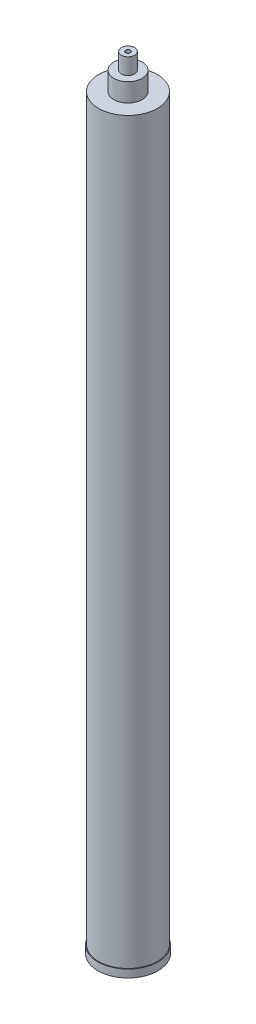
ISO-10303-21;
HEADER;
FILE_DESCRIPTION(('STEP AP214'),'2;1');
FILE_NAME('part.step','',(''),(''),'','','');
FILE_SCHEMA(('AUTOMOTIVE_DESIGN { 1 0 10303 214 1 1 1 1 }'));
ENDSEC;
DATA;
#1=APPLICATION_CONTEXT('core data for automotive mechanical design processes');
#2=APPLICATION_PROTOCOL_DEFINITION('international standard','automotive_design',2000,#1);
#3=PRODUCT_CONTEXT('',#1,'mechanical');
#4=PRODUCT('Part','Part','',(#3));
#5=PRODUCT_RELATED_PRODUCT_CATEGORY('part','',(#4));
#6=PRODUCT_DEFINITION_FORMATION('','',#4);
#7=PRODUCT_DEFINITION_CONTEXT('part definition',#1,'design');
#8=PRODUCT_DEFINITION('design','',#6,#7);
#9=PRODUCT_DEFINITION_SHAPE('','',#8);
#10=(LENGTH_UNIT() NAMED_UNIT(*) SI_UNIT(.MILLI.,.METRE.));
#11=(NAMED_UNIT(*) PLANE_ANGLE_UNIT() SI_UNIT($,.RADIAN.));
#12=(NAMED_UNIT(*) SI_UNIT($,.STERADIAN.) SOLID_ANGLE_UNIT());
#13=UNCERTAINTY_MEASURE_WITH_UNIT(LENGTH_MEASURE(1.E-05),#10,'distance_accuracy_value','');
#14=(GEOMETRIC_REPRESENTATION_CONTEXT(3) GLOBAL_UNCERTAINTY_ASSIGNED_CONTEXT((#13)) GLOBAL_UNIT_ASSIGNED_CONTEXT((#10,
#11,#12)) REPRESENTATION_CONTEXT('',''));
#15=CARTESIAN_POINT('',(0.,0.,0.));
#16=DIRECTION('',(0.,0.,1.));
#17=DIRECTION('',(1.,0.,0.));
#18=AXIS2_PLACEMENT_3D('',#15,#16,#17);
#19=CARTESIAN_POINT('',(0.,1239.,0.));
#20=DIRECTION('',(0.,-1.,0.));
#21=DIRECTION('',(0.,0.,-1.));
#22=AXIS2_PLACEMENT_3D('',#19,#20,#21);
#23=CYLINDRICAL_SURFACE('',#22,49.25);
#24=CARTESIAN_POINT('',(0.,1239.,0.));
#25=DIRECTION('',(0.,1.,0.));
#26=DIRECTION('',(0.,0.,1.));
#27=AXIS2_PLACEMENT_3D('',#24,#25,#26);
#28=CIRCLE('',#27,49.25);
#29=CARTESIAN_POINT('',(0.,1239.,49.25));
#30=VERTEX_POINT('',#29);
#31=EDGE_CURVE('E73',#30,#30,#28,.T.);
#32=ORIENTED_EDGE('',*,*,#31,.F.);
#33=EDGE_LOOP('',(#32));
#34=FACE_BOUND('',#33,.T.);
#35=CARTESIAN_POINT('',(0.,0.,0.));
#36=DIRECTION('',(0.,1.,0.));
#37=DIRECTION('',(0.,0.,1.));
#38=AXIS2_PLACEMENT_3D('',#35,#36,#37);
#39=CIRCLE('',#38,49.25);
#40=CARTESIAN_POINT('',(0.,0.,49.25));
#41=VERTEX_POINT('',#40);
#42=EDGE_CURVE('E41',#41,#41,#39,.T.);
#43=ORIENTED_EDGE('',*,*,#42,.T.);
#44=EDGE_LOOP('',(#43));
#45=FACE_BOUND('',#44,.T.);
#46=ADVANCED_FACE('F38',(#34,#45),#23,.T.);
#47=CARTESIAN_POINT('',(0.,1239.,0.));
#48=DIRECTION('',(0.,1.,0.));
#49=DIRECTION('',(0.,0.,1.));
#50=AXIS2_PLACEMENT_3D('',#47,#48,#49);
#51=PLANE('',#50);
#52=CARTESIAN_POINT('',(0.,1239.,0.));
#53=DIRECTION('',(0.,1.,0.));
#54=DIRECTION('',(0.,0.,1.));
#55=AXIS2_PLACEMENT_3D('',#52,#53,#54);
#56=CIRCLE('',#55,23.75);
#57=CARTESIAN_POINT('',(0.,1239.,23.75));
#58=VERTEX_POINT('',#57);
#59=EDGE_CURVE('E45',#58,#58,#56,.T.);
#60=ORIENTED_EDGE('',*,*,#59,.F.);
#61=EDGE_LOOP('',(#60));
#62=FACE_BOUND('',#61,.T.);
#63=ORIENTED_EDGE('',*,*,#31,.T.);
#64=EDGE_LOOP('',(#63));
#65=FACE_BOUND('',#64,.T.);
#66=ADVANCED_FACE('F95',(#62,#65),#51,.T.);
#67=CARTESIAN_POINT('',(0.,-13.,0.));
#68=DIRECTION('',(0.,1.,0.));
#69=DIRECTION('',(0.,0.,1.));
#70=AXIS2_PLACEMENT_3D('',#67,#68,#69);
#71=CYLINDRICAL_SURFACE('',#70,50.45);
#72=CARTESIAN_POINT('',(0.,-13.,0.));
#73=DIRECTION('',(0.,-1.,0.));
#74=DIRECTION('',(0.,0.,-1.));
#75=AXIS2_PLACEMENT_3D('',#72,#73,#74);
#76=CIRCLE('',#75,50.45);
#77=CARTESIAN_POINT('',(0.,-13.,50.45));
#78=VERTEX_POINT('',#77);
#79=EDGE_CURVE('E74',#78,#78,#76,.T.);
#80=CARTESIAN_POINT('',(0.,0.,0.));
#81=DIRECTION('',(0.,-1.,0.));
#82=DIRECTION('',(0.,0.,-1.));
#83=AXIS2_PLACEMENT_3D('',#80,#81,#82);
#84=CIRCLE('',#83,50.45);
#85=CARTESIAN_POINT('',(0.,0.,50.45));
#86=VERTEX_POINT('',#85);
#87=EDGE_CURVE('E70',#86,#86,#84,.T.);
#88=CARTESIAN_POINT('',(0.,-13.,50.45));
#89=CARTESIAN_POINT('',(0.,-12.8645833333333,50.45));
#90=CARTESIAN_POINT('',(0.,-12.7291666666667,50.45));
#91=CARTESIAN_POINT('',(0.,-12.4583333333333,50.45));
#92=CARTESIAN_POINT('',(0.,-12.3229166666667,50.45));
#93=CARTESIAN_POINT('',(0.,-12.0520833333333,50.45));
#94=CARTESIAN_POINT('',(0.,-11.9166666666667,50.45));
#95=CARTESIAN_POINT('',(0.,-11.6458333333333,50.45));
#96=CARTESIAN_POINT('',(0.,-11.5104166666667,50.45));
#97=CARTESIAN_POINT('',(0.,-11.2395833333333,50.45));
#98=CARTESIAN_POINT('',(0.,-11.1041666666667,50.45));
#99=CARTESIAN_POINT('',(0.,-10.8333333333333,50.45));
#100=CARTESIAN_POINT('',(0.,-10.6979166666667,50.45));
#101=CARTESIAN_POINT('',(0.,-10.4270833333333,50.45));
#102=CARTESIAN_POINT('',(0.,-10.2916666666667,50.45));
#103=CARTESIAN_POINT('',(0.,-10.0208333333333,50.45));
#104=CARTESIAN_POINT('',(0.,-9.88541666666667,50.45));
#105=CARTESIAN_POINT('',(0.,-9.61458333333333,50.45));
#106=CARTESIAN_POINT('',(0.,-9.47916666666667,50.45));
#107=CARTESIAN_POINT('',(0.,-9.20833333333333,50.45));
#108=CARTESIAN_POINT('',(0.,-9.07291666666667,50.45));
#109=CARTESIAN_POINT('',(0.,-8.80208333333333,50.45));
#110=CARTESIAN_POINT('',(0.,-8.66666666666667,50.45));
#111=CARTESIAN_POINT('',(0.,-8.39583333333333,50.45));
#112=CARTESIAN_POINT('',(0.,-8.26041666666667,50.45));
#113=CARTESIAN_POINT('',(0.,-7.98958333333333,50.45));
#114=CARTESIAN_POINT('',(0.,-7.85416666666667,50.45));
#115=CARTESIAN_POINT('',(0.,-7.58333333333333,50.45));
#116=CARTESIAN_POINT('',(0.,-7.44791666666667,50.45));
#117=CARTESIAN_POINT('',(0.,-7.17708333333333,50.45));
#118=CARTESIAN_POINT('',(0.,-7.04166666666667,50.45));
#119=CARTESIAN_POINT('',(0.,-6.77083333333333,50.45));
#120=CARTESIAN_POINT('',(0.,-6.63541666666667,50.45));
#121=CARTESIAN_POINT('',(0.,-6.36458333333333,50.45));
#122=CARTESIAN_POINT('',(0.,-6.22916666666667,50.45));
#123=CARTESIAN_POINT('',(0.,-5.95833333333333,50.45));
#124=CARTESIAN_POINT('',(0.,-5.82291666666667,50.45));
#125=CARTESIAN_POINT('',(0.,-5.55208333333333,50.45));
#126=CARTESIAN_POINT('',(0.,-5.41666666666667,50.45));
#127=CARTESIAN_POINT('',(0.,-5.14583333333333,50.45));
#128=CARTESIAN_POINT('',(0.,-5.01041666666667,50.45));
#129=CARTESIAN_POINT('',(0.,-4.73958333333333,50.45));
#130=CARTESIAN_POINT('',(0.,-4.60416666666667,50.45));
#131=CARTESIAN_POINT('',(0.,-4.33333333333333,50.45));
#132=CARTESIAN_POINT('',(0.,-4.19791666666667,50.45));
#133=CARTESIAN_POINT('',(0.,-3.92708333333333,50.45));
#134=CARTESIAN_POINT('',(0.,-3.79166666666667,50.45));
#135=CARTESIAN_POINT('',(0.,-3.52083333333333,50.45));
#136=CARTESIAN_POINT('',(0.,-3.38541666666667,50.45));
#137=CARTESIAN_POINT('',(0.,-3.11458333333333,50.45));
#138=CARTESIAN_POINT('',(0.,-2.97916666666667,50.45));
#139=CARTESIAN_POINT('',(0.,-2.70833333333333,50.45));
#140=CARTESIAN_POINT('',(0.,-2.57291666666667,50.45));
#141=CARTESIAN_POINT('',(0.,-2.30208333333333,50.45));
#142=CARTESIAN_POINT('',(0.,-2.16666666666667,50.45));
#143=CARTESIAN_POINT('',(0.,-1.89583333333333,50.45));
#144=CARTESIAN_POINT('',(0.,-1.76041666666667,50.45));
#145=CARTESIAN_POINT('',(0.,-1.48958333333333,50.45));
#146=CARTESIAN_POINT('',(0.,-1.35416666666667,50.45));
#147=CARTESIAN_POINT('',(0.,-1.08333333333333,50.45));
#148=CARTESIAN_POINT('',(0.,-0.947916666666667,50.45));
#149=CARTESIAN_POINT('',(0.,-0.677083333333334,50.45));
#150=CARTESIAN_POINT('',(0.,-0.541666666666667,50.45));
#151=CARTESIAN_POINT('',(0.,-0.270833333333334,50.45));
#152=CARTESIAN_POINT('',(0.,-0.135416666666667,50.45));
#153=CARTESIAN_POINT('',(0.,0.,50.45));
#154=B_SPLINE_CURVE_WITH_KNOTS('',3,(#88,#89,#90,#91,#92,#93,#94,#95,#96,#97,#98,#99,#100,#101,
#102,#103,#104,#105,#106,#107,#108,#109,#110,#111,#112,#113,#114,#115,#116,#117,#118,#119,#120,
#121,#122,#123,#124,#125,#126,#127,#128,#129,#130,#131,#132,#133,#134,#135,#136,#137,#138,#139,
#140,#141,#142,#143,#144,#145,#146,#147,#148,#149,#150,#151,#152,#153),.UNSPECIFIED.,.F.,.F.,(4,
2,2,2,2,2,2,2,2,2,2,2,2,2,2,2,2,2,2,2,2,2,2,2,2,2,2,2,2,2,2,2,4),(0.,0.406249999999999,
0.812499999999999,1.21875,1.625,2.03125,2.4375,2.84375,3.25,3.65625,4.0625,4.46875,4.875,
5.28125,5.6875,6.09375,6.5,6.90625,7.3125,7.71875,8.125,8.53125,8.9375,9.34375,9.75,10.15625,
10.5625,10.96875,11.375,11.78125,12.1875,12.59375,13.),.UNSPECIFIED.);
#155=EDGE_CURVE('BSEAM93',#78,#86,#154,.T.);
#156=ORIENTED_EDGE('',*,*,#79,.F.);
#157=ORIENTED_EDGE('',*,*,#87,.T.);
#158=ORIENTED_EDGE('',*,*,#155,.T.);
#159=ORIENTED_EDGE('',*,*,#155,.F.);
#160=EDGE_LOOP('',(#156,#158,#157,#159));
#161=FACE_BOUND('',#160,.T.);
#162=ADVANCED_FACE('F93',(#161),#71,.T.);
#163=CARTESIAN_POINT('',(0.,-13.,0.));
#164=DIRECTION('',(0.,-1.,0.));
#165=DIRECTION('',(0.,0.,-1.));
#166=AXIS2_PLACEMENT_3D('',#163,#164,#165);
#167=PLANE('',#166);
#168=ORIENTED_EDGE('',*,*,#79,.T.);
#169=EDGE_LOOP('',(#168));
#170=FACE_BOUND('',#169,.T.);
#171=ADVANCED_FACE('F89',(#170),#167,.T.);
#172=CARTESIAN_POINT('',(0.,0.,0.));
#173=DIRECTION('',(0.,-1.,0.));
#174=DIRECTION('',(0.,0.,-1.));
#175=AXIS2_PLACEMENT_3D('',#172,#173,#174);
#176=PLANE('',#175);
#177=ORIENTED_EDGE('',*,*,#42,.F.);
#178=EDGE_LOOP('',(#177));
#179=FACE_BOUND('',#178,.T.);
#180=ORIENTED_EDGE('',*,*,#87,.F.);
#181=EDGE_LOOP('',(#180));
#182=FACE_BOUND('',#181,.T.);
#183=ADVANCED_FACE('F85',(#179,#182),#176,.F.);
#184=CARTESIAN_POINT('',(0.,1270.,0.));
#185=DIRECTION('',(0.,-1.,0.));
#186=DIRECTION('',(0.,0.,-1.));
#187=AXIS2_PLACEMENT_3D('',#184,#185,#186);
#188=CYLINDRICAL_SURFACE('',#187,23.75);
#189=CARTESIAN_POINT('',(0.,1270.,0.));
#190=DIRECTION('',(0.,1.,0.));
#191=DIRECTION('',(0.,0.,1.));
#192=AXIS2_PLACEMENT_3D('',#189,#190,#191);
#193=CIRCLE('',#192,23.75);
#194=CARTESIAN_POINT('',(0.,1270.,23.75));
#195=VERTEX_POINT('',#194);
#196=EDGE_CURVE('E63',#195,#195,#193,.T.);
#197=ORIENTED_EDGE('',*,*,#196,.F.);
#198=EDGE_LOOP('',(#197));
#199=FACE_BOUND('',#198,.T.);
#200=ORIENTED_EDGE('',*,*,#59,.T.);
#201=EDGE_LOOP('',(#200));
#202=FACE_BOUND('',#201,.T.);
#203=ADVANCED_FACE('F88',(#199,#202),#188,.T.);
#204=CARTESIAN_POINT('',(0.,1270.,0.));
#205=DIRECTION('',(0.,1.,0.));
#206=DIRECTION('',(0.,0.,1.));
#207=AXIS2_PLACEMENT_3D('',#204,#205,#206);
#208=PLANE('',#207);
#209=CARTESIAN_POINT('',(0.,1270.,0.));
#210=DIRECTION('',(0.,1.,0.));
#211=DIRECTION('',(0.,0.,1.));
#212=AXIS2_PLACEMENT_3D('',#209,#210,#211);
#213=CIRCLE('',#212,11.125);
#214=CARTESIAN_POINT('',(0.,1270.,11.125));
#215=VERTEX_POINT('',#214);
#216=EDGE_CURVE('E11',#215,#215,#213,.T.);
#217=ORIENTED_EDGE('',*,*,#216,.F.);
#218=EDGE_LOOP('',(#217));
#219=FACE_BOUND('',#218,.T.);
#220=ORIENTED_EDGE('',*,*,#196,.T.);
#221=EDGE_LOOP('',(#220));
#222=FACE_BOUND('',#221,.T.);
#223=ADVANCED_FACE('F128',(#219,#222),#208,.T.);
#224=CARTESIAN_POINT('',(0.,1297.2,0.));
#225=DIRECTION('',(0.,-1.,0.));
#226=DIRECTION('',(0.,0.,-1.));
#227=AXIS2_PLACEMENT_3D('',#224,#225,#226);
#228=CYLINDRICAL_SURFACE('',#227,11.125);
#229=CARTESIAN_POINT('',(0.,1297.2,0.));
#230=DIRECTION('',(0.,1.,0.));
#231=DIRECTION('',(0.,0.,1.));
#232=AXIS2_PLACEMENT_3D('',#229,#230,#231);
#233=CIRCLE('',#232,11.125);
#234=CARTESIAN_POINT('',(0.,1297.2,11.125));
#235=VERTEX_POINT('',#234);
#236=EDGE_CURVE('E59',#235,#235,#233,.T.);
#237=ORIENTED_EDGE('',*,*,#236,.F.);
#238=EDGE_LOOP('',(#237));
#239=FACE_BOUND('',#238,.T.);
#240=ORIENTED_EDGE('',*,*,#216,.T.);
#241=EDGE_LOOP('',(#240));
#242=FACE_BOUND('',#241,.T.);
#243=ADVANCED_FACE('F138',(#239,#242),#228,.T.);
#244=CARTESIAN_POINT('',(0.,1297.2,0.));
#245=DIRECTION('',(0.,1.,0.));
#246=DIRECTION('',(0.,0.,1.));
#247=AXIS2_PLACEMENT_3D('',#244,#245,#246);
#248=PLANE('',#247);
#249=CARTESIAN_POINT('',(0.,1297.2,0.));
#250=DIRECTION('',(0.,1.,0.));
#251=DIRECTION('',(0.,0.,1.));
#252=AXIS2_PLACEMENT_3D('',#249,#250,#251);
#253=CIRCLE('',#252,3.96874999999999);
#254=CARTESIAN_POINT('',(0.,1297.2,3.96874999999999));
#255=VERTEX_POINT('',#254);
#256=EDGE_CURVE('E60',#255,#255,#253,.T.);
#257=ORIENTED_EDGE('',*,*,#256,.F.);
#258=EDGE_LOOP('',(#257));
#259=FACE_BOUND('',#258,.T.);
#260=ORIENTED_EDGE('',*,*,#236,.T.);
#261=EDGE_LOOP('',(#260));
#262=FACE_BOUND('',#261,.T.);
#263=ADVANCED_FACE('F53',(#259,#262),#248,.T.);
#264=CARTESIAN_POINT('',(0.,1269.9,0.));
#265=DIRECTION('',(0.,1.,0.));
#266=DIRECTION('',(0.,0.,1.));
#267=AXIS2_PLACEMENT_3D('',#264,#265,#266);
#268=CONICAL_SURFACE('',#267,3.96874999999999,1.02974425867669);
#269=CARTESIAN_POINT('',(0.,1267.51533441823,0.));
#270=VERTEX_POINT('',#269);
#271=VERTEX_LOOP('',#270);
#272=FACE_BOUND('',#271,.T.);
#273=CARTESIAN_POINT('',(0.,1269.9,0.));
#274=DIRECTION('',(0.,1.,0.));
#275=DIRECTION('',(0.,0.,1.));
#276=AXIS2_PLACEMENT_3D('',#273,#274,#275);
#277=CIRCLE('',#276,3.96874999999999);
#278=CARTESIAN_POINT('',(0.,1269.9,3.96874999999999));
#279=VERTEX_POINT('',#278);
#280=EDGE_CURVE('E57',#279,#279,#277,.T.);
#281=ORIENTED_EDGE('',*,*,#280,.T.);
#282=EDGE_LOOP('',(#281));
#283=FACE_BOUND('',#282,.T.);
#284=ADVANCED_FACE('F49',(#272,#283),#268,.F.);
#285=CARTESIAN_POINT('',(0.,1297.2,0.));
#286=DIRECTION('',(0.,1.,0.));
#287=DIRECTION('',(0.,0.,1.));
#288=AXIS2_PLACEMENT_3D('',#285,#286,#287);
#289=CYLINDRICAL_SURFACE('',#288,3.96874999999999);
#290=ORIENTED_EDGE('',*,*,#280,.F.);
#291=EDGE_LOOP('',(#290));
#292=FACE_BOUND('',#291,.T.);
#293=ORIENTED_EDGE('',*,*,#256,.T.);
#294=EDGE_LOOP('',(#293));
#295=FACE_BOUND('',#294,.T.);
#296=ADVANCED_FACE('F52',(#292,#295),#289,.F.);
#297=CLOSED_SHELL('',(#46,#66,#162,#171,#183,#203,#223,#243,#263,#284,#296));
#298=MANIFOLD_SOLID_BREP('B2',#297);
#299=ADVANCED_BREP_SHAPE_REPRESENTATION('',(#18,#298),#14);
#300=SHAPE_DEFINITION_REPRESENTATION(#9,#299);
ENDSEC;
END-ISO-10303-21;
